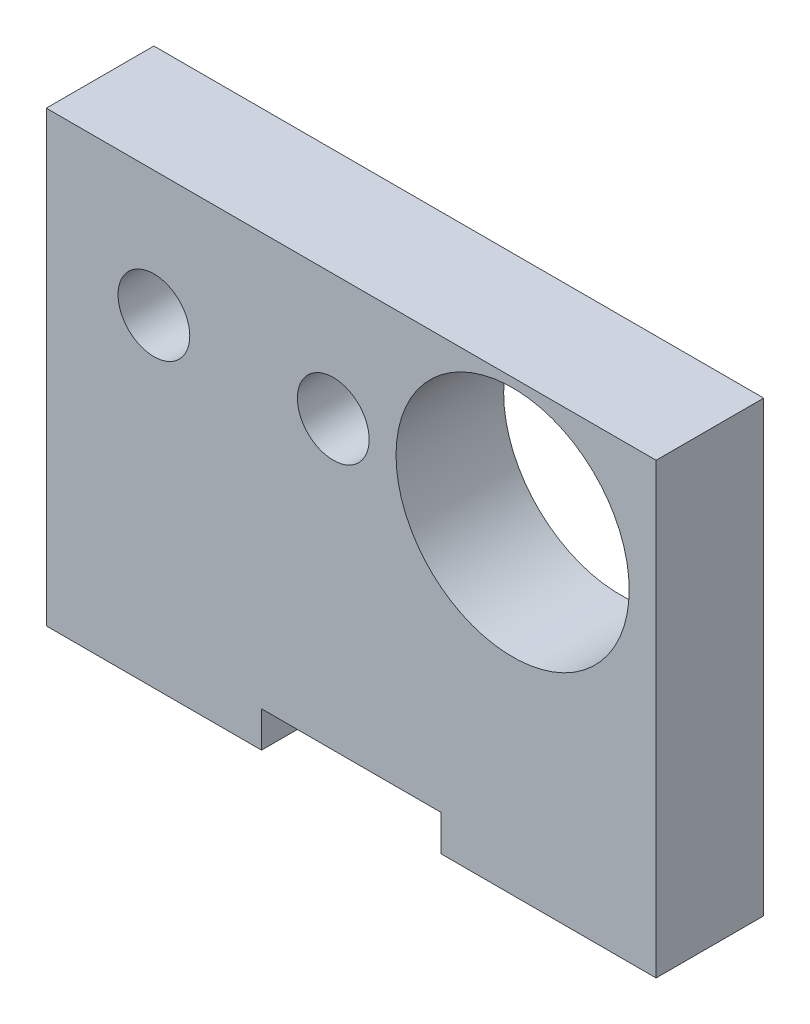
ISO-10303-21;
HEADER;
FILE_DESCRIPTION(('STEP AP214'),'2;1');
FILE_NAME('part.step','',(''),(''),'','','');
FILE_SCHEMA(('AUTOMOTIVE_DESIGN { 1 0 10303 214 1 1 1 1 }'));
ENDSEC;
DATA;
#1=APPLICATION_CONTEXT('core data for automotive mechanical design processes');
#2=APPLICATION_PROTOCOL_DEFINITION('international standard','automotive_design',2000,#1);
#3=PRODUCT_CONTEXT('',#1,'mechanical');
#4=PRODUCT('Part','Part','',(#3));
#5=PRODUCT_RELATED_PRODUCT_CATEGORY('part','',(#4));
#6=PRODUCT_DEFINITION_FORMATION('','',#4);
#7=PRODUCT_DEFINITION_CONTEXT('part definition',#1,'design');
#8=PRODUCT_DEFINITION('design','',#6,#7);
#9=PRODUCT_DEFINITION_SHAPE('','',#8);
#10=(LENGTH_UNIT() NAMED_UNIT(*) SI_UNIT(.MILLI.,.METRE.));
#11=(NAMED_UNIT(*) PLANE_ANGLE_UNIT() SI_UNIT($,.RADIAN.));
#12=(NAMED_UNIT(*) SI_UNIT($,.STERADIAN.) SOLID_ANGLE_UNIT());
#13=UNCERTAINTY_MEASURE_WITH_UNIT(LENGTH_MEASURE(1.E-05),#10,'distance_accuracy_value','');
#14=(GEOMETRIC_REPRESENTATION_CONTEXT(3) GLOBAL_UNCERTAINTY_ASSIGNED_CONTEXT((#13)) GLOBAL_UNIT_ASSIGNED_CONTEXT((#10,
#11,#12)) REPRESENTATION_CONTEXT('',''));
#15=CARTESIAN_POINT('',(0.,0.,0.));
#16=DIRECTION('',(0.,0.,1.));
#17=DIRECTION('',(1.,0.,0.));
#18=AXIS2_PLACEMENT_3D('',#15,#16,#17);
#19=CARTESIAN_POINT('',(0.,0.,6.));
#20=DIRECTION('',(1.,0.,0.));
#21=DIRECTION('',(0.,0.,-1.));
#22=AXIS2_PLACEMENT_3D('',#19,#20,#21);
#23=PLANE('',#22);
#24=DIRECTION('',(0.,-1.,0.));
#25=VECTOR('',#24,1.);
#26=CARTESIAN_POINT('',(0.,0.,0.));
#27=LINE('',#26,#25);
#28=CARTESIAN_POINT('',(0.,25.,0.));
#29=VERTEX_POINT('',#28);
#30=CARTESIAN_POINT('',(0.,0.,0.));
#31=VERTEX_POINT('',#30);
#32=EDGE_CURVE('E129',#29,#31,#27,.T.);
#33=ORIENTED_EDGE('',*,*,#32,.T.);
#34=DIRECTION('',(0.,0.,-1.));
#35=VECTOR('',#34,1.);
#36=CARTESIAN_POINT('',(0.,0.,6.));
#37=LINE('',#36,#35);
#38=CARTESIAN_POINT('',(0.,0.,6.));
#39=VERTEX_POINT('',#38);
#40=EDGE_CURVE('E11',#39,#31,#37,.T.);
#41=ORIENTED_EDGE('',*,*,#40,.F.);
#42=DIRECTION('',(0.,-1.,0.));
#43=VECTOR('',#42,1.);
#44=CARTESIAN_POINT('',(0.,0.,6.));
#45=LINE('',#44,#43);
#46=CARTESIAN_POINT('',(0.,25.,6.));
#47=VERTEX_POINT('',#46);
#48=EDGE_CURVE('E144',#47,#39,#45,.T.);
#49=ORIENTED_EDGE('',*,*,#48,.F.);
#50=DIRECTION('',(0.,0.,-1.));
#51=VECTOR('',#50,1.);
#52=CARTESIAN_POINT('',(0.,25.,6.));
#53=LINE('',#52,#51);
#54=EDGE_CURVE('E125',#47,#29,#53,.T.);
#55=ORIENTED_EDGE('',*,*,#54,.T.);
#56=EDGE_LOOP('',(#33,#41,#49,#55));
#57=FACE_BOUND('',#56,.T.);
#58=ADVANCED_FACE('F33',(#57),#23,.F.);
#59=CARTESIAN_POINT('',(0.,0.,6.));
#60=DIRECTION('',(0.,1.,0.));
#61=DIRECTION('',(0.,0.,1.));
#62=AXIS2_PLACEMENT_3D('',#59,#60,#61);
#63=PLANE('',#62);
#64=DIRECTION('',(1.,0.,0.));
#65=VECTOR('',#64,1.);
#66=CARTESIAN_POINT('',(0.,0.,0.));
#67=LINE('',#66,#65);
#68=CARTESIAN_POINT('',(12.,0.,0.));
#69=VERTEX_POINT('',#68);
#70=EDGE_CURVE('E132',#31,#69,#67,.T.);
#71=ORIENTED_EDGE('',*,*,#70,.T.);
#72=DIRECTION('',(0.,0.,-1.));
#73=VECTOR('',#72,1.);
#74=CARTESIAN_POINT('',(12.,0.,6.));
#75=LINE('',#74,#73);
#76=CARTESIAN_POINT('',(12.,0.,6.));
#77=VERTEX_POINT('',#76);
#78=EDGE_CURVE('E41',#77,#69,#75,.T.);
#79=ORIENTED_EDGE('',*,*,#78,.F.);
#80=DIRECTION('',(1.,0.,0.));
#81=VECTOR('',#80,1.);
#82=CARTESIAN_POINT('',(0.,0.,6.));
#83=LINE('',#82,#81);
#84=EDGE_CURVE('E92',#39,#77,#83,.T.);
#85=ORIENTED_EDGE('',*,*,#84,.F.);
#86=ORIENTED_EDGE('',*,*,#40,.T.);
#87=EDGE_LOOP('',(#71,#79,#85,#86));
#88=FACE_BOUND('',#87,.T.);
#89=ADVANCED_FACE('F225',(#88),#63,.F.);
#90=CARTESIAN_POINT('',(12.,0.,6.));
#91=DIRECTION('',(-1.,0.,0.));
#92=DIRECTION('',(0.,0.,1.));
#93=AXIS2_PLACEMENT_3D('',#90,#91,#92);
#94=PLANE('',#93);
#95=DIRECTION('',(0.,1.,0.));
#96=VECTOR('',#95,1.);
#97=CARTESIAN_POINT('',(12.,0.,0.));
#98=LINE('',#97,#96);
#99=CARTESIAN_POINT('',(12.,2.,0.));
#100=VERTEX_POINT('',#99);
#101=EDGE_CURVE('E135',#69,#100,#98,.T.);
#102=ORIENTED_EDGE('',*,*,#101,.T.);
#103=DIRECTION('',(0.,0.,-1.));
#104=VECTOR('',#103,1.);
#105=CARTESIAN_POINT('',(12.,2.,6.));
#106=LINE('',#105,#104);
#107=CARTESIAN_POINT('',(12.,2.,6.));
#108=VERTEX_POINT('',#107);
#109=EDGE_CURVE('E151',#108,#100,#106,.T.);
#110=ORIENTED_EDGE('',*,*,#109,.F.);
#111=DIRECTION('',(0.,1.,0.));
#112=VECTOR('',#111,1.);
#113=CARTESIAN_POINT('',(12.,0.,6.));
#114=LINE('',#113,#112);
#115=EDGE_CURVE('E159',#77,#108,#114,.T.);
#116=ORIENTED_EDGE('',*,*,#115,.F.);
#117=ORIENTED_EDGE('',*,*,#78,.T.);
#118=EDGE_LOOP('',(#102,#110,#116,#117));
#119=FACE_BOUND('',#118,.T.);
#120=ADVANCED_FACE('F157',(#119),#94,.F.);
#121=CARTESIAN_POINT('',(12.,2.,6.));
#122=DIRECTION('',(0.,1.,0.));
#123=DIRECTION('',(0.,0.,1.));
#124=AXIS2_PLACEMENT_3D('',#121,#122,#123);
#125=PLANE('',#124);
#126=DIRECTION('',(1.,0.,0.));
#127=VECTOR('',#126,1.);
#128=CARTESIAN_POINT('',(12.,2.,0.));
#129=LINE('',#128,#127);
#130=CARTESIAN_POINT('',(22.,2.,0.));
#131=VERTEX_POINT('',#130);
#132=EDGE_CURVE('E137',#100,#131,#129,.T.);
#133=ORIENTED_EDGE('',*,*,#132,.T.);
#134=DIRECTION('',(0.,0.,-1.));
#135=VECTOR('',#134,1.);
#136=CARTESIAN_POINT('',(22.,2.,6.));
#137=LINE('',#136,#135);
#138=CARTESIAN_POINT('',(22.,2.,6.));
#139=VERTEX_POINT('',#138);
#140=EDGE_CURVE('E148',#139,#131,#137,.T.);
#141=ORIENTED_EDGE('',*,*,#140,.F.);
#142=DIRECTION('',(1.,0.,0.));
#143=VECTOR('',#142,1.);
#144=CARTESIAN_POINT('',(12.,2.,6.));
#145=LINE('',#144,#143);
#146=EDGE_CURVE('E171',#108,#139,#145,.T.);
#147=ORIENTED_EDGE('',*,*,#146,.F.);
#148=ORIENTED_EDGE('',*,*,#109,.T.);
#149=EDGE_LOOP('',(#133,#141,#147,#148));
#150=FACE_BOUND('',#149,.T.);
#151=ADVANCED_FACE('F167',(#150),#125,.F.);
#152=CARTESIAN_POINT('',(22.,0.,6.));
#153=DIRECTION('',(1.,0.,0.));
#154=DIRECTION('',(0.,0.,-1.));
#155=AXIS2_PLACEMENT_3D('',#152,#153,#154);
#156=PLANE('',#155);
#157=DIRECTION('',(0.,-1.,0.));
#158=VECTOR('',#157,1.);
#159=CARTESIAN_POINT('',(22.,0.,0.));
#160=LINE('',#159,#158);
#161=CARTESIAN_POINT('',(22.,0.,0.));
#162=VERTEX_POINT('',#161);
#163=EDGE_CURVE('E139',#131,#162,#160,.T.);
#164=ORIENTED_EDGE('',*,*,#163,.T.);
#165=DIRECTION('',(0.,0.,-1.));
#166=VECTOR('',#165,1.);
#167=CARTESIAN_POINT('',(22.,0.,6.));
#168=LINE('',#167,#166);
#169=CARTESIAN_POINT('',(22.,0.,6.));
#170=VERTEX_POINT('',#169);
#171=EDGE_CURVE('E120',#170,#162,#168,.T.);
#172=ORIENTED_EDGE('',*,*,#171,.F.);
#173=DIRECTION('',(0.,-1.,0.));
#174=VECTOR('',#173,1.);
#175=CARTESIAN_POINT('',(22.,0.,6.));
#176=LINE('',#175,#174);
#177=EDGE_CURVE('E111',#139,#170,#176,.T.);
#178=ORIENTED_EDGE('',*,*,#177,.F.);
#179=ORIENTED_EDGE('',*,*,#140,.T.);
#180=EDGE_LOOP('',(#164,#172,#178,#179));
#181=FACE_BOUND('',#180,.T.);
#182=ADVANCED_FACE('F170',(#181),#156,.F.);
#183=CARTESIAN_POINT('',(22.,0.,6.));
#184=DIRECTION('',(0.,1.,0.));
#185=DIRECTION('',(0.,0.,1.));
#186=AXIS2_PLACEMENT_3D('',#183,#184,#185);
#187=PLANE('',#186);
#188=DIRECTION('',(1.,0.,0.));
#189=VECTOR('',#188,1.);
#190=CARTESIAN_POINT('',(22.,0.,0.));
#191=LINE('',#190,#189);
#192=CARTESIAN_POINT('',(34.,0.,0.));
#193=VERTEX_POINT('',#192);
#194=EDGE_CURVE('E119',#162,#193,#191,.T.);
#195=ORIENTED_EDGE('',*,*,#194,.T.);
#196=DIRECTION('',(0.,0.,-1.));
#197=VECTOR('',#196,1.);
#198=CARTESIAN_POINT('',(34.,0.,6.));
#199=LINE('',#198,#197);
#200=CARTESIAN_POINT('',(34.,0.,6.));
#201=VERTEX_POINT('',#200);
#202=EDGE_CURVE('E116',#201,#193,#199,.T.);
#203=ORIENTED_EDGE('',*,*,#202,.F.);
#204=DIRECTION('',(1.,0.,0.));
#205=VECTOR('',#204,1.);
#206=CARTESIAN_POINT('',(22.,0.,6.));
#207=LINE('',#206,#205);
#208=EDGE_CURVE('E105',#170,#201,#207,.T.);
#209=ORIENTED_EDGE('',*,*,#208,.F.);
#210=ORIENTED_EDGE('',*,*,#171,.T.);
#211=EDGE_LOOP('',(#195,#203,#209,#210));
#212=FACE_BOUND('',#211,.T.);
#213=ADVANCED_FACE('F117',(#212),#187,.F.);
#214=CARTESIAN_POINT('',(34.,0.,6.));
#215=DIRECTION('',(-1.,0.,0.));
#216=DIRECTION('',(0.,0.,1.));
#217=AXIS2_PLACEMENT_3D('',#214,#215,#216);
#218=PLANE('',#217);
#219=DIRECTION('',(0.,1.,0.));
#220=VECTOR('',#219,1.);
#221=CARTESIAN_POINT('',(34.,0.,0.));
#222=LINE('',#221,#220);
#223=CARTESIAN_POINT('',(34.,25.,0.));
#224=VERTEX_POINT('',#223);
#225=EDGE_CURVE('E78',#193,#224,#222,.T.);
#226=ORIENTED_EDGE('',*,*,#225,.T.);
#227=DIRECTION('',(0.,0.,-1.));
#228=VECTOR('',#227,1.);
#229=CARTESIAN_POINT('',(34.,25.,6.));
#230=LINE('',#229,#228);
#231=CARTESIAN_POINT('',(34.,25.,6.));
#232=VERTEX_POINT('',#231);
#233=EDGE_CURVE('E121',#232,#224,#230,.T.);
#234=ORIENTED_EDGE('',*,*,#233,.F.);
#235=DIRECTION('',(0.,1.,0.));
#236=VECTOR('',#235,1.);
#237=CARTESIAN_POINT('',(34.,0.,6.));
#238=LINE('',#237,#236);
#239=EDGE_CURVE('E109',#201,#232,#238,.T.);
#240=ORIENTED_EDGE('',*,*,#239,.F.);
#241=ORIENTED_EDGE('',*,*,#202,.T.);
#242=EDGE_LOOP('',(#226,#234,#240,#241));
#243=FACE_BOUND('',#242,.T.);
#244=ADVANCED_FACE('F123',(#243),#218,.F.);
#245=CARTESIAN_POINT('',(0.,25.,6.));
#246=DIRECTION('',(0.,-1.,0.));
#247=DIRECTION('',(0.,0.,-1.));
#248=AXIS2_PLACEMENT_3D('',#245,#246,#247);
#249=PLANE('',#248);
#250=DIRECTION('',(-1.,0.,0.));
#251=VECTOR('',#250,1.);
#252=CARTESIAN_POINT('',(0.,25.,0.));
#253=LINE('',#252,#251);
#254=EDGE_CURVE('E84',#224,#29,#253,.T.);
#255=ORIENTED_EDGE('',*,*,#254,.T.);
#256=ORIENTED_EDGE('',*,*,#54,.F.);
#257=DIRECTION('',(-1.,0.,0.));
#258=VECTOR('',#257,1.);
#259=CARTESIAN_POINT('',(0.,25.,6.));
#260=LINE('',#259,#258);
#261=EDGE_CURVE('E49',#232,#47,#260,.T.);
#262=ORIENTED_EDGE('',*,*,#261,.F.);
#263=ORIENTED_EDGE('',*,*,#233,.T.);
#264=EDGE_LOOP('',(#255,#256,#262,#263));
#265=FACE_BOUND('',#264,.T.);
#266=ADVANCED_FACE('F206',(#265),#249,.F.);
#267=CARTESIAN_POINT('',(0.,0.,6.));
#268=DIRECTION('',(0.,0.,-1.));
#269=DIRECTION('',(-1.,0.,0.));
#270=AXIS2_PLACEMENT_3D('',#267,#268,#269);
#271=PLANE('',#270);
#272=CARTESIAN_POINT('',(6.,18.,6.));
#273=DIRECTION('',(0.,0.,1.));
#274=DIRECTION('',(1.,0.,0.));
#275=AXIS2_PLACEMENT_3D('',#272,#273,#274);
#276=CIRCLE('',#275,2.);
#277=CARTESIAN_POINT('',(8.,18.,6.));
#278=VERTEX_POINT('',#277);
#279=EDGE_CURVE('E189',#278,#278,#276,.T.);
#280=ORIENTED_EDGE('',*,*,#279,.F.);
#281=EDGE_LOOP('',(#280));
#282=FACE_BOUND('',#281,.T.);
#283=CARTESIAN_POINT('',(26.,18.,6.));
#284=DIRECTION('',(0.,0.,1.));
#285=DIRECTION('',(1.,0.,0.));
#286=AXIS2_PLACEMENT_3D('',#283,#284,#285);
#287=CIRCLE('',#286,6.5);
#288=CARTESIAN_POINT('',(32.5,18.,6.));
#289=VERTEX_POINT('',#288);
#290=EDGE_CURVE('E183',#289,#289,#287,.T.);
#291=ORIENTED_EDGE('',*,*,#290,.F.);
#292=EDGE_LOOP('',(#291));
#293=FACE_BOUND('',#292,.T.);
#294=CARTESIAN_POINT('',(16.,18.,6.));
#295=DIRECTION('',(0.,0.,1.));
#296=DIRECTION('',(1.,0.,0.));
#297=AXIS2_PLACEMENT_3D('',#294,#295,#296);
#298=CIRCLE('',#297,2.);
#299=CARTESIAN_POINT('',(18.,18.,6.));
#300=VERTEX_POINT('',#299);
#301=EDGE_CURVE('E177',#300,#300,#298,.T.);
#302=ORIENTED_EDGE('',*,*,#301,.F.);
#303=EDGE_LOOP('',(#302));
#304=FACE_BOUND('',#303,.T.);
#305=ORIENTED_EDGE('',*,*,#48,.T.);
#306=ORIENTED_EDGE('',*,*,#84,.T.);
#307=ORIENTED_EDGE('',*,*,#115,.T.);
#308=ORIENTED_EDGE('',*,*,#146,.T.);
#309=ORIENTED_EDGE('',*,*,#177,.T.);
#310=ORIENTED_EDGE('',*,*,#208,.T.);
#311=ORIENTED_EDGE('',*,*,#239,.T.);
#312=ORIENTED_EDGE('',*,*,#261,.T.);
#313=EDGE_LOOP('',(#305,#306,#307,#308,#309,#310,#311,#312));
#314=FACE_BOUND('',#313,.T.);
#315=ADVANCED_FACE('F107',(#282,#293,#304,#314),#271,.F.);
#316=CARTESIAN_POINT('',(0.,0.,0.));
#317=DIRECTION('',(0.,0.,-1.));
#318=DIRECTION('',(-1.,0.,0.));
#319=AXIS2_PLACEMENT_3D('',#316,#317,#318);
#320=PLANE('',#319);
#321=CARTESIAN_POINT('',(6.,18.,0.));
#322=DIRECTION('',(0.,0.,1.));
#323=DIRECTION('',(1.,0.,0.));
#324=AXIS2_PLACEMENT_3D('',#321,#322,#323);
#325=CIRCLE('',#324,2.);
#326=CARTESIAN_POINT('',(8.,18.,0.));
#327=VERTEX_POINT('',#326);
#328=EDGE_CURVE('E186',#327,#327,#325,.T.);
#329=ORIENTED_EDGE('',*,*,#328,.T.);
#330=EDGE_LOOP('',(#329));
#331=FACE_BOUND('',#330,.T.);
#332=CARTESIAN_POINT('',(26.,18.,0.));
#333=DIRECTION('',(0.,0.,1.));
#334=DIRECTION('',(1.,0.,0.));
#335=AXIS2_PLACEMENT_3D('',#332,#333,#334);
#336=CIRCLE('',#335,6.5);
#337=CARTESIAN_POINT('',(32.5,18.,0.));
#338=VERTEX_POINT('',#337);
#339=EDGE_CURVE('E180',#338,#338,#336,.T.);
#340=ORIENTED_EDGE('',*,*,#339,.T.);
#341=EDGE_LOOP('',(#340));
#342=FACE_BOUND('',#341,.T.);
#343=CARTESIAN_POINT('',(16.,18.,0.));
#344=DIRECTION('',(0.,0.,1.));
#345=DIRECTION('',(1.,0.,0.));
#346=AXIS2_PLACEMENT_3D('',#343,#344,#345);
#347=CIRCLE('',#346,2.);
#348=CARTESIAN_POINT('',(18.,18.,0.));
#349=VERTEX_POINT('',#348);
#350=EDGE_CURVE('E133',#349,#349,#347,.T.);
#351=ORIENTED_EDGE('',*,*,#350,.T.);
#352=EDGE_LOOP('',(#351));
#353=FACE_BOUND('',#352,.T.);
#354=ORIENTED_EDGE('',*,*,#32,.F.);
#355=ORIENTED_EDGE('',*,*,#254,.F.);
#356=ORIENTED_EDGE('',*,*,#225,.F.);
#357=ORIENTED_EDGE('',*,*,#194,.F.);
#358=ORIENTED_EDGE('',*,*,#163,.F.);
#359=ORIENTED_EDGE('',*,*,#132,.F.);
#360=ORIENTED_EDGE('',*,*,#101,.F.);
#361=ORIENTED_EDGE('',*,*,#70,.F.);
#362=EDGE_LOOP('',(#354,#355,#356,#357,#358,#359,#360,#361));
#363=FACE_BOUND('',#362,.T.);
#364=ADVANCED_FACE('F163',(#331,#342,#353,#363),#320,.T.);
#365=CARTESIAN_POINT('',(16.,18.,0.));
#366=DIRECTION('',(0.,0.,1.));
#367=DIRECTION('',(1.,0.,0.));
#368=AXIS2_PLACEMENT_3D('',#365,#366,#367);
#369=CYLINDRICAL_SURFACE('',#368,2.);
#370=ORIENTED_EDGE('',*,*,#350,.F.);
#371=EDGE_LOOP('',(#370));
#372=FACE_BOUND('',#371,.T.);
#373=ORIENTED_EDGE('',*,*,#301,.T.);
#374=EDGE_LOOP('',(#373));
#375=FACE_BOUND('',#374,.T.);
#376=ADVANCED_FACE('F212',(#372,#375),#369,.F.);
#377=CARTESIAN_POINT('',(26.,18.,0.));
#378=DIRECTION('',(0.,0.,1.));
#379=DIRECTION('',(1.,0.,0.));
#380=AXIS2_PLACEMENT_3D('',#377,#378,#379);
#381=CYLINDRICAL_SURFACE('',#380,6.5);
#382=ORIENTED_EDGE('',*,*,#339,.F.);
#383=EDGE_LOOP('',(#382));
#384=FACE_BOUND('',#383,.T.);
#385=ORIENTED_EDGE('',*,*,#290,.T.);
#386=EDGE_LOOP('',(#385));
#387=FACE_BOUND('',#386,.T.);
#388=ADVANCED_FACE('F200',(#384,#387),#381,.F.);
#389=CARTESIAN_POINT('',(6.,18.,0.));
#390=DIRECTION('',(0.,0.,1.));
#391=DIRECTION('',(1.,0.,0.));
#392=AXIS2_PLACEMENT_3D('',#389,#390,#391);
#393=CYLINDRICAL_SURFACE('',#392,2.);
#394=ORIENTED_EDGE('',*,*,#328,.F.);
#395=EDGE_LOOP('',(#394));
#396=FACE_BOUND('',#395,.T.);
#397=ORIENTED_EDGE('',*,*,#279,.T.);
#398=EDGE_LOOP('',(#397));
#399=FACE_BOUND('',#398,.T.);
#400=ADVANCED_FACE('F197',(#396,#399),#393,.F.);
#401=CLOSED_SHELL('',(#58,#89,#120,#151,#182,#213,#244,#266,#315,#364,#376,#388,#400));
#402=MANIFOLD_SOLID_BREP('B2',#401);
#403=ADVANCED_BREP_SHAPE_REPRESENTATION('',(#18,#402),#14);
#404=SHAPE_DEFINITION_REPRESENTATION(#9,#403);
ENDSEC;
END-ISO-10303-21;
